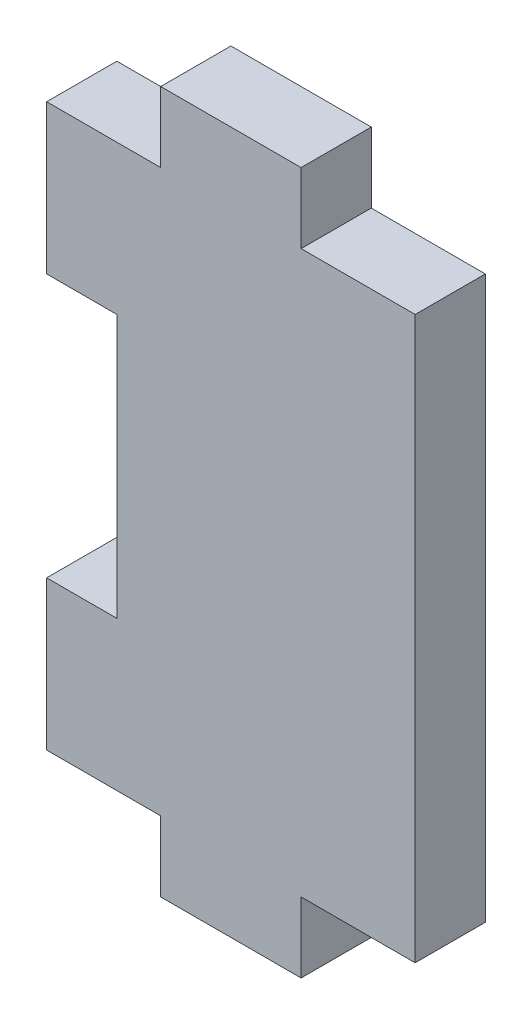
ISO-10303-21;
HEADER;
FILE_DESCRIPTION(('STEP AP214'),'2;1');
FILE_NAME('part.step','',(''),(''),'','','');
FILE_SCHEMA(('AUTOMOTIVE_DESIGN { 1 0 10303 214 1 1 1 1 }'));
ENDSEC;
DATA;
#1=APPLICATION_CONTEXT('core data for automotive mechanical design processes');
#2=APPLICATION_PROTOCOL_DEFINITION('international standard','automotive_design',2000,#1);
#3=PRODUCT_CONTEXT('',#1,'mechanical');
#4=PRODUCT('Part','Part','',(#3));
#5=PRODUCT_RELATED_PRODUCT_CATEGORY('part','',(#4));
#6=PRODUCT_DEFINITION_FORMATION('','',#4);
#7=PRODUCT_DEFINITION_CONTEXT('part definition',#1,'design');
#8=PRODUCT_DEFINITION('design','',#6,#7);
#9=PRODUCT_DEFINITION_SHAPE('','',#8);
#10=(LENGTH_UNIT() NAMED_UNIT(*) SI_UNIT(.MILLI.,.METRE.));
#11=(NAMED_UNIT(*) PLANE_ANGLE_UNIT() SI_UNIT($,.RADIAN.));
#12=(NAMED_UNIT(*) SI_UNIT($,.STERADIAN.) SOLID_ANGLE_UNIT());
#13=UNCERTAINTY_MEASURE_WITH_UNIT(LENGTH_MEASURE(1.E-05),#10,'distance_accuracy_value','');
#14=(GEOMETRIC_REPRESENTATION_CONTEXT(3) GLOBAL_UNCERTAINTY_ASSIGNED_CONTEXT((#13)) GLOBAL_UNIT_ASSIGNED_CONTEXT((#10,
#11,#12)) REPRESENTATION_CONTEXT('',''));
#15=CARTESIAN_POINT('',(0.,0.,0.));
#16=DIRECTION('',(0.,0.,1.));
#17=DIRECTION('',(1.,0.,0.));
#18=AXIS2_PLACEMENT_3D('',#15,#16,#17);
#19=CARTESIAN_POINT('',(0.,0.,4.));
#20=DIRECTION('',(1.,0.,0.));
#21=DIRECTION('',(0.,0.,-1.));
#22=AXIS2_PLACEMENT_3D('',#19,#20,#21);
#23=PLANE('',#22);
#24=DIRECTION('',(0.,-1.,0.));
#25=VECTOR('',#24,1.);
#26=CARTESIAN_POINT('',(0.,0.,0.));
#27=LINE('',#26,#25);
#28=CARTESIAN_POINT('',(0.,36.,0.));
#29=VERTEX_POINT('',#28);
#30=CARTESIAN_POINT('',(0.,27.5,0.));
#31=VERTEX_POINT('',#30);
#32=EDGE_CURVE('E193',#29,#31,#27,.T.);
#33=ORIENTED_EDGE('',*,*,#32,.T.);
#34=DIRECTION('',(0.,0.,1.));
#35=VECTOR('',#34,1.);
#36=CARTESIAN_POINT('',(0.,27.5,0.));
#37=LINE('',#36,#35);
#38=CARTESIAN_POINT('',(0.,27.5,4.));
#39=VERTEX_POINT('',#38);
#40=EDGE_CURVE('E282',#31,#39,#37,.T.);
#41=ORIENTED_EDGE('',*,*,#40,.T.);
#42=DIRECTION('',(0.,-1.,0.));
#43=VECTOR('',#42,1.);
#44=CARTESIAN_POINT('',(0.,0.,4.));
#45=LINE('',#44,#43);
#46=CARTESIAN_POINT('',(0.,36.,4.));
#47=VERTEX_POINT('',#46);
#48=EDGE_CURVE('E234',#47,#39,#45,.T.);
#49=ORIENTED_EDGE('',*,*,#48,.F.);
#50=DIRECTION('',(0.,0.,1.));
#51=VECTOR('',#50,1.);
#52=CARTESIAN_POINT('',(0.,36.,0.));
#53=LINE('',#52,#51);
#54=EDGE_CURVE('E224',#29,#47,#53,.T.);
#55=ORIENTED_EDGE('',*,*,#54,.F.);
#56=EDGE_LOOP('',(#33,#41,#49,#55));
#57=FACE_BOUND('',#56,.T.);
#58=ADVANCED_FACE('F42',(#57),#23,.F.);
#59=CARTESIAN_POINT('',(0.,12.5,4.));
#60=VERTEX_POINT('',#59);
#61=CARTESIAN_POINT('',(0.,3.99999999999999,4.));
#62=VERTEX_POINT('',#61);
#63=EDGE_CURVE('E191',#60,#62,#45,.T.);
#64=ORIENTED_EDGE('',*,*,#63,.F.);
#65=DIRECTION('',(0.,0.,1.));
#66=VECTOR('',#65,1.);
#67=CARTESIAN_POINT('',(0.,12.5,0.));
#68=LINE('',#67,#66);
#69=CARTESIAN_POINT('',(0.,12.5,0.));
#70=VERTEX_POINT('',#69);
#71=EDGE_CURVE('E298',#70,#60,#68,.T.);
#72=ORIENTED_EDGE('',*,*,#71,.F.);
#73=CARTESIAN_POINT('',(0.,3.99999999999999,0.));
#74=VERTEX_POINT('',#73);
#75=EDGE_CURVE('E196',#70,#74,#27,.T.);
#76=ORIENTED_EDGE('',*,*,#75,.T.);
#77=DIRECTION('',(0.,0.,1.));
#78=VECTOR('',#77,1.);
#79=CARTESIAN_POINT('',(0.,3.99999999999999,0.));
#80=LINE('',#79,#78);
#81=EDGE_CURVE('E268',#74,#62,#80,.T.);
#82=ORIENTED_EDGE('',*,*,#81,.T.);
#83=EDGE_LOOP('',(#64,#72,#76,#82));
#84=FACE_BOUND('',#83,.T.);
#85=ADVANCED_FACE('F44',(#84),#23,.F.);
#86=CARTESIAN_POINT('',(0.,0.,4.));
#87=DIRECTION('',(0.,1.,0.));
#88=DIRECTION('',(0.,0.,1.));
#89=AXIS2_PLACEMENT_3D('',#86,#87,#88);
#90=PLANE('',#89);
#91=DIRECTION('',(1.,0.,0.));
#92=VECTOR('',#91,1.);
#93=CARTESIAN_POINT('',(0.,0.,4.));
#94=LINE('',#93,#92);
#95=CARTESIAN_POINT('',(6.49999999999992,0.,4.));
#96=VERTEX_POINT('',#95);
#97=CARTESIAN_POINT('',(14.5000000000001,0.,4.));
#98=VERTEX_POINT('',#97);
#99=EDGE_CURVE('E235',#96,#98,#94,.T.);
#100=ORIENTED_EDGE('',*,*,#99,.F.);
#101=DIRECTION('',(0.,0.,1.));
#102=VECTOR('',#101,1.);
#103=CARTESIAN_POINT('',(6.49999999999992,0.,0.));
#104=LINE('',#103,#102);
#105=CARTESIAN_POINT('',(6.49999999999992,0.,0.));
#106=VERTEX_POINT('',#105);
#107=EDGE_CURVE('E265',#106,#96,#104,.T.);
#108=ORIENTED_EDGE('',*,*,#107,.F.);
#109=DIRECTION('',(1.,0.,0.));
#110=VECTOR('',#109,1.);
#111=CARTESIAN_POINT('',(0.,0.,0.));
#112=LINE('',#111,#110);
#113=CARTESIAN_POINT('',(14.5000000000001,0.,0.));
#114=VERTEX_POINT('',#113);
#115=EDGE_CURVE('E187',#106,#114,#112,.T.);
#116=ORIENTED_EDGE('',*,*,#115,.T.);
#117=DIRECTION('',(0.,0.,1.));
#118=VECTOR('',#117,1.);
#119=CARTESIAN_POINT('',(14.5000000000001,0.,0.));
#120=LINE('',#119,#118);
#121=EDGE_CURVE('E363',#114,#98,#120,.T.);
#122=ORIENTED_EDGE('',*,*,#121,.T.);
#123=EDGE_LOOP('',(#100,#108,#116,#122));
#124=FACE_BOUND('',#123,.T.);
#125=ADVANCED_FACE('F377',(#124),#90,.F.);
#126=CARTESIAN_POINT('',(21.,0.,4.));
#127=DIRECTION('',(-1.,0.,0.));
#128=DIRECTION('',(0.,0.,1.));
#129=AXIS2_PLACEMENT_3D('',#126,#127,#128);
#130=PLANE('',#129);
#131=DIRECTION('',(0.,1.,0.));
#132=VECTOR('',#131,1.);
#133=CARTESIAN_POINT('',(21.,0.,4.));
#134=LINE('',#133,#132);
#135=CARTESIAN_POINT('',(21.,4.,4.));
#136=VERTEX_POINT('',#135);
#137=CARTESIAN_POINT('',(21.,36.,4.));
#138=VERTEX_POINT('',#137);
#139=EDGE_CURVE('E52',#136,#138,#134,.T.);
#140=ORIENTED_EDGE('',*,*,#139,.F.);
#141=DIRECTION('',(0.,0.,1.));
#142=VECTOR('',#141,1.);
#143=CARTESIAN_POINT('',(21.,4.,0.));
#144=LINE('',#143,#142);
#145=CARTESIAN_POINT('',(21.,4.,0.));
#146=VERTEX_POINT('',#145);
#147=EDGE_CURVE('E185',#146,#136,#144,.T.);
#148=ORIENTED_EDGE('',*,*,#147,.F.);
#149=DIRECTION('',(0.,1.,0.));
#150=VECTOR('',#149,1.);
#151=CARTESIAN_POINT('',(21.,0.,0.));
#152=LINE('',#151,#150);
#153=CARTESIAN_POINT('',(21.,36.,0.));
#154=VERTEX_POINT('',#153);
#155=EDGE_CURVE('E178',#146,#154,#152,.T.);
#156=ORIENTED_EDGE('',*,*,#155,.T.);
#157=DIRECTION('',(0.,0.,1.));
#158=VECTOR('',#157,1.);
#159=CARTESIAN_POINT('',(21.,36.,0.));
#160=LINE('',#159,#158);
#161=EDGE_CURVE('E157',#154,#138,#160,.T.);
#162=ORIENTED_EDGE('',*,*,#161,.T.);
#163=EDGE_LOOP('',(#140,#148,#156,#162));
#164=FACE_BOUND('',#163,.T.);
#165=ADVANCED_FACE('F184',(#164),#130,.F.);
#166=CARTESIAN_POINT('',(0.,40.,4.));
#167=DIRECTION('',(0.,-1.,0.));
#168=DIRECTION('',(0.,0.,-1.));
#169=AXIS2_PLACEMENT_3D('',#166,#167,#168);
#170=PLANE('',#169);
#171=DIRECTION('',(-1.,0.,0.));
#172=VECTOR('',#171,1.);
#173=CARTESIAN_POINT('',(0.,40.,4.));
#174=LINE('',#173,#172);
#175=CARTESIAN_POINT('',(14.5000000000001,40.,4.));
#176=VERTEX_POINT('',#175);
#177=CARTESIAN_POINT('',(6.49999999999992,40.,4.));
#178=VERTEX_POINT('',#177);
#179=EDGE_CURVE('E12',#176,#178,#174,.T.);
#180=ORIENTED_EDGE('',*,*,#179,.F.);
#181=DIRECTION('',(0.,0.,1.));
#182=VECTOR('',#181,1.);
#183=CARTESIAN_POINT('',(14.5000000000001,40.,0.));
#184=LINE('',#183,#182);
#185=CARTESIAN_POINT('',(14.5000000000001,40.,0.));
#186=VERTEX_POINT('',#185);
#187=EDGE_CURVE('E169',#186,#176,#184,.T.);
#188=ORIENTED_EDGE('',*,*,#187,.F.);
#189=DIRECTION('',(-1.,0.,0.));
#190=VECTOR('',#189,1.);
#191=CARTESIAN_POINT('',(0.,40.,0.));
#192=LINE('',#191,#190);
#193=CARTESIAN_POINT('',(6.49999999999992,40.,0.));
#194=VERTEX_POINT('',#193);
#195=EDGE_CURVE('E46',#186,#194,#192,.T.);
#196=ORIENTED_EDGE('',*,*,#195,.T.);
#197=DIRECTION('',(0.,0.,1.));
#198=VECTOR('',#197,1.);
#199=CARTESIAN_POINT('',(6.49999999999992,40.,0.));
#200=LINE('',#199,#198);
#201=EDGE_CURVE('E227',#194,#178,#200,.T.);
#202=ORIENTED_EDGE('',*,*,#201,.T.);
#203=EDGE_LOOP('',(#180,#188,#196,#202));
#204=FACE_BOUND('',#203,.T.);
#205=ADVANCED_FACE('F383',(#204),#170,.F.);
#206=CARTESIAN_POINT('',(0.,0.,4.));
#207=DIRECTION('',(0.,0.,-1.));
#208=DIRECTION('',(-1.,0.,0.));
#209=AXIS2_PLACEMENT_3D('',#206,#207,#208);
#210=PLANE('',#209);
#211=ORIENTED_EDGE('',*,*,#48,.T.);
#212=DIRECTION('',(-1.,0.,0.));
#213=VECTOR('',#212,1.);
#214=CARTESIAN_POINT('',(4.00000000000001,27.5,4.));
#215=LINE('',#214,#213);
#216=CARTESIAN_POINT('',(4.00000000000001,27.5,4.));
#217=VERTEX_POINT('',#216);
#218=EDGE_CURVE('E283',#217,#39,#215,.T.);
#219=ORIENTED_EDGE('',*,*,#218,.F.);
#220=DIRECTION('',(0.,1.,0.));
#221=VECTOR('',#220,1.);
#222=CARTESIAN_POINT('',(4.00000000000001,27.5,4.));
#223=LINE('',#222,#221);
#224=CARTESIAN_POINT('',(4.,12.5,4.));
#225=VERTEX_POINT('',#224);
#226=EDGE_CURVE('E276',#225,#217,#223,.T.);
#227=ORIENTED_EDGE('',*,*,#226,.F.);
#228=DIRECTION('',(1.,0.,0.));
#229=VECTOR('',#228,1.);
#230=CARTESIAN_POINT('',(4.,12.5,4.));
#231=LINE('',#230,#229);
#232=EDGE_CURVE('E286',#60,#225,#231,.T.);
#233=ORIENTED_EDGE('',*,*,#232,.F.);
#234=ORIENTED_EDGE('',*,*,#63,.T.);
#235=DIRECTION('',(-1.,0.,0.));
#236=VECTOR('',#235,1.);
#237=CARTESIAN_POINT('',(6.49999999999993,4.,4.));
#238=LINE('',#237,#236);
#239=CARTESIAN_POINT('',(6.49999999999993,4.,4.));
#240=VERTEX_POINT('',#239);
#241=EDGE_CURVE('E249',#240,#62,#238,.T.);
#242=ORIENTED_EDGE('',*,*,#241,.F.);
#243=DIRECTION('',(0.,1.,0.));
#244=VECTOR('',#243,1.);
#245=CARTESIAN_POINT('',(6.49999999999993,4.,4.));
#246=LINE('',#245,#244);
#247=EDGE_CURVE('E253',#96,#240,#246,.T.);
#248=ORIENTED_EDGE('',*,*,#247,.F.);
#249=ORIENTED_EDGE('',*,*,#99,.T.);
#250=DIRECTION('',(0.,-1.,0.));
#251=VECTOR('',#250,1.);
#252=CARTESIAN_POINT('',(14.5000000000001,4.,4.));
#253=LINE('',#252,#251);
#254=CARTESIAN_POINT('',(14.5000000000001,4.,4.));
#255=VERTEX_POINT('',#254);
#256=EDGE_CURVE('E264',#255,#98,#253,.T.);
#257=ORIENTED_EDGE('',*,*,#256,.F.);
#258=DIRECTION('',(-1.,0.,0.));
#259=VECTOR('',#258,1.);
#260=CARTESIAN_POINT('',(14.5000000000001,4.,4.));
#261=LINE('',#260,#259);
#262=EDGE_CURVE('E330',#136,#255,#261,.T.);
#263=ORIENTED_EDGE('',*,*,#262,.F.);
#264=ORIENTED_EDGE('',*,*,#139,.T.);
#265=DIRECTION('',(1.,0.,0.));
#266=VECTOR('',#265,1.);
#267=CARTESIAN_POINT('',(14.5000000000001,36.,4.));
#268=LINE('',#267,#266);
#269=CARTESIAN_POINT('',(14.5000000000001,36.,4.));
#270=VERTEX_POINT('',#269);
#271=EDGE_CURVE('E163',#270,#138,#268,.T.);
#272=ORIENTED_EDGE('',*,*,#271,.F.);
#273=DIRECTION('',(0.,-1.,0.));
#274=VECTOR('',#273,1.);
#275=CARTESIAN_POINT('',(14.5000000000001,36.,4.));
#276=LINE('',#275,#274);
#277=EDGE_CURVE('E181',#176,#270,#276,.T.);
#278=ORIENTED_EDGE('',*,*,#277,.F.);
#279=ORIENTED_EDGE('',*,*,#179,.T.);
#280=DIRECTION('',(0.,1.,0.));
#281=VECTOR('',#280,1.);
#282=CARTESIAN_POINT('',(6.49999999999992,36.,4.));
#283=LINE('',#282,#281);
#284=CARTESIAN_POINT('',(6.49999999999992,36.,4.));
#285=VERTEX_POINT('',#284);
#286=EDGE_CURVE('E209',#285,#178,#283,.T.);
#287=ORIENTED_EDGE('',*,*,#286,.F.);
#288=DIRECTION('',(1.,0.,0.));
#289=VECTOR('',#288,1.);
#290=CARTESIAN_POINT('',(6.49999999999992,36.,4.));
#291=LINE('',#290,#289);
#292=EDGE_CURVE('E213',#47,#285,#291,.T.);
#293=ORIENTED_EDGE('',*,*,#292,.F.);
#294=EDGE_LOOP('',(#211,#219,#227,#233,#234,#242,#248,#249,#257,#263,#264,#272,#278,#279,#287,#293));
#295=FACE_BOUND('',#294,.T.);
#296=ADVANCED_FACE('F327',(#295),#210,.F.);
#297=CARTESIAN_POINT('',(0.,0.,0.));
#298=DIRECTION('',(0.,0.,-1.));
#299=DIRECTION('',(-1.,0.,0.));
#300=AXIS2_PLACEMENT_3D('',#297,#298,#299);
#301=PLANE('',#300);
#302=DIRECTION('',(-1.,0.,0.));
#303=VECTOR('',#302,1.);
#304=CARTESIAN_POINT('',(4.00000000000001,27.5,0.));
#305=LINE('',#304,#303);
#306=CARTESIAN_POINT('',(4.00000000000001,27.5,0.));
#307=VERTEX_POINT('',#306);
#308=EDGE_CURVE('E272',#307,#31,#305,.T.);
#309=ORIENTED_EDGE('',*,*,#308,.T.);
#310=ORIENTED_EDGE('',*,*,#32,.F.);
#311=DIRECTION('',(1.,0.,0.));
#312=VECTOR('',#311,1.);
#313=CARTESIAN_POINT('',(6.49999999999992,36.,0.));
#314=LINE('',#313,#312);
#315=CARTESIAN_POINT('',(6.49999999999992,36.,0.));
#316=VERTEX_POINT('',#315);
#317=EDGE_CURVE('E215',#29,#316,#314,.T.);
#318=ORIENTED_EDGE('',*,*,#317,.T.);
#319=DIRECTION('',(0.,1.,0.));
#320=VECTOR('',#319,1.);
#321=CARTESIAN_POINT('',(6.49999999999992,36.,0.));
#322=LINE('',#321,#320);
#323=EDGE_CURVE('E221',#316,#194,#322,.T.);
#324=ORIENTED_EDGE('',*,*,#323,.T.);
#325=ORIENTED_EDGE('',*,*,#195,.F.);
#326=DIRECTION('',(0.,-1.,0.));
#327=VECTOR('',#326,1.);
#328=CARTESIAN_POINT('',(14.5000000000001,36.,0.));
#329=LINE('',#328,#327);
#330=CARTESIAN_POINT('',(14.5000000000001,36.,0.));
#331=VERTEX_POINT('',#330);
#332=EDGE_CURVE('E170',#186,#331,#329,.T.);
#333=ORIENTED_EDGE('',*,*,#332,.T.);
#334=DIRECTION('',(1.,0.,0.));
#335=VECTOR('',#334,1.);
#336=CARTESIAN_POINT('',(14.5000000000001,36.,0.));
#337=LINE('',#336,#335);
#338=EDGE_CURVE('E160',#331,#154,#337,.T.);
#339=ORIENTED_EDGE('',*,*,#338,.T.);
#340=ORIENTED_EDGE('',*,*,#155,.F.);
#341=DIRECTION('',(-1.,0.,0.));
#342=VECTOR('',#341,1.);
#343=CARTESIAN_POINT('',(14.5000000000001,4.,0.));
#344=LINE('',#343,#342);
#345=CARTESIAN_POINT('',(14.5000000000001,4.,0.));
#346=VERTEX_POINT('',#345);
#347=EDGE_CURVE('E339',#146,#346,#344,.T.);
#348=ORIENTED_EDGE('',*,*,#347,.T.);
#349=DIRECTION('',(0.,-1.,0.));
#350=VECTOR('',#349,1.);
#351=CARTESIAN_POINT('',(14.5000000000001,4.,0.));
#352=LINE('',#351,#350);
#353=EDGE_CURVE('E334',#346,#114,#352,.T.);
#354=ORIENTED_EDGE('',*,*,#353,.T.);
#355=ORIENTED_EDGE('',*,*,#115,.F.);
#356=DIRECTION('',(0.,1.,0.));
#357=VECTOR('',#356,1.);
#358=CARTESIAN_POINT('',(6.49999999999993,4.,0.));
#359=LINE('',#358,#357);
#360=CARTESIAN_POINT('',(6.49999999999993,4.,0.));
#361=VERTEX_POINT('',#360);
#362=EDGE_CURVE('E255',#106,#361,#359,.T.);
#363=ORIENTED_EDGE('',*,*,#362,.T.);
#364=DIRECTION('',(-1.,0.,0.));
#365=VECTOR('',#364,1.);
#366=CARTESIAN_POINT('',(6.49999999999993,4.,0.));
#367=LINE('',#366,#365);
#368=EDGE_CURVE('E68',#361,#74,#367,.T.);
#369=ORIENTED_EDGE('',*,*,#368,.T.);
#370=ORIENTED_EDGE('',*,*,#75,.F.);
#371=DIRECTION('',(1.,0.,0.));
#372=VECTOR('',#371,1.);
#373=CARTESIAN_POINT('',(4.,12.5,0.));
#374=LINE('',#373,#372);
#375=CARTESIAN_POINT('',(4.,12.5,0.));
#376=VERTEX_POINT('',#375);
#377=EDGE_CURVE('E275',#70,#376,#374,.T.);
#378=ORIENTED_EDGE('',*,*,#377,.T.);
#379=DIRECTION('',(0.,1.,0.));
#380=VECTOR('',#379,1.);
#381=CARTESIAN_POINT('',(4.00000000000001,27.5,0.));
#382=LINE('',#381,#380);
#383=EDGE_CURVE('E60',#376,#307,#382,.T.);
#384=ORIENTED_EDGE('',*,*,#383,.T.);
#385=EDGE_LOOP('',(#309,#310,#318,#324,#325,#333,#339,#340,#348,#354,#355,#363,#369,#370,#378,#384));
#386=FACE_BOUND('',#385,.T.);
#387=ADVANCED_FACE('F176',(#386),#301,.T.);
#388=CARTESIAN_POINT('',(6.49999999999992,36.,0.));
#389=DIRECTION('',(1.,0.,0.));
#390=DIRECTION('',(0.,0.,-1.));
#391=AXIS2_PLACEMENT_3D('',#388,#389,#390);
#392=PLANE('',#391);
#393=ORIENTED_EDGE('',*,*,#286,.T.);
#394=ORIENTED_EDGE('',*,*,#201,.F.);
#395=ORIENTED_EDGE('',*,*,#323,.F.);
#396=DIRECTION('',(0.,0.,1.));
#397=VECTOR('',#396,1.);
#398=CARTESIAN_POINT('',(6.49999999999992,36.,0.));
#399=LINE('',#398,#397);
#400=EDGE_CURVE('E199',#316,#285,#399,.T.);
#401=ORIENTED_EDGE('',*,*,#400,.T.);
#402=EDGE_LOOP('',(#393,#394,#395,#401));
#403=FACE_BOUND('',#402,.T.);
#404=ADVANCED_FACE('F429',(#403),#392,.F.);
#405=CARTESIAN_POINT('',(6.49999999999992,36.,0.));
#406=DIRECTION('',(0.,-1.,0.));
#407=DIRECTION('',(0.,0.,-1.));
#408=AXIS2_PLACEMENT_3D('',#405,#406,#407);
#409=PLANE('',#408);
#410=ORIENTED_EDGE('',*,*,#292,.T.);
#411=ORIENTED_EDGE('',*,*,#400,.F.);
#412=ORIENTED_EDGE('',*,*,#317,.F.);
#413=ORIENTED_EDGE('',*,*,#54,.T.);
#414=EDGE_LOOP('',(#410,#411,#412,#413));
#415=FACE_BOUND('',#414,.T.);
#416=ADVANCED_FACE('F312',(#415),#409,.F.);
#417=CARTESIAN_POINT('',(14.5000000000001,36.,0.));
#418=DIRECTION('',(0.,-1.,0.));
#419=DIRECTION('',(0.,0.,-1.));
#420=AXIS2_PLACEMENT_3D('',#417,#418,#419);
#421=PLANE('',#420);
#422=ORIENTED_EDGE('',*,*,#271,.T.);
#423=ORIENTED_EDGE('',*,*,#161,.F.);
#424=ORIENTED_EDGE('',*,*,#338,.F.);
#425=DIRECTION('',(0.,0.,1.));
#426=VECTOR('',#425,1.);
#427=CARTESIAN_POINT('',(14.5000000000001,36.,0.));
#428=LINE('',#427,#426);
#429=EDGE_CURVE('E214',#331,#270,#428,.T.);
#430=ORIENTED_EDGE('',*,*,#429,.T.);
#431=EDGE_LOOP('',(#422,#423,#424,#430));
#432=FACE_BOUND('',#431,.T.);
#433=ADVANCED_FACE('F159',(#432),#421,.F.);
#434=CARTESIAN_POINT('',(14.5000000000001,36.,0.));
#435=DIRECTION('',(-1.,0.,0.));
#436=DIRECTION('',(0.,0.,1.));
#437=AXIS2_PLACEMENT_3D('',#434,#435,#436);
#438=PLANE('',#437);
#439=ORIENTED_EDGE('',*,*,#277,.T.);
#440=ORIENTED_EDGE('',*,*,#429,.F.);
#441=ORIENTED_EDGE('',*,*,#332,.F.);
#442=ORIENTED_EDGE('',*,*,#187,.T.);
#443=EDGE_LOOP('',(#439,#440,#441,#442));
#444=FACE_BOUND('',#443,.T.);
#445=ADVANCED_FACE('F455',(#444),#438,.F.);
#446=CARTESIAN_POINT('',(14.5000000000001,4.,0.));
#447=DIRECTION('',(-1.,0.,0.));
#448=DIRECTION('',(0.,0.,1.));
#449=AXIS2_PLACEMENT_3D('',#446,#447,#448);
#450=PLANE('',#449);
#451=ORIENTED_EDGE('',*,*,#256,.T.);
#452=ORIENTED_EDGE('',*,*,#121,.F.);
#453=ORIENTED_EDGE('',*,*,#353,.F.);
#454=DIRECTION('',(0.,0.,1.));
#455=VECTOR('',#454,1.);
#456=CARTESIAN_POINT('',(14.5000000000001,4.,0.));
#457=LINE('',#456,#455);
#458=EDGE_CURVE('E346',#346,#255,#457,.T.);
#459=ORIENTED_EDGE('',*,*,#458,.T.);
#460=EDGE_LOOP('',(#451,#452,#453,#459));
#461=FACE_BOUND('',#460,.T.);
#462=ADVANCED_FACE('F464',(#461),#450,.F.);
#463=CARTESIAN_POINT('',(14.5000000000001,4.,0.));
#464=DIRECTION('',(0.,1.,0.));
#465=DIRECTION('',(0.,0.,1.));
#466=AXIS2_PLACEMENT_3D('',#463,#464,#465);
#467=PLANE('',#466);
#468=ORIENTED_EDGE('',*,*,#262,.T.);
#469=ORIENTED_EDGE('',*,*,#458,.F.);
#470=ORIENTED_EDGE('',*,*,#347,.F.);
#471=ORIENTED_EDGE('',*,*,#147,.T.);
#472=EDGE_LOOP('',(#468,#469,#470,#471));
#473=FACE_BOUND('',#472,.T.);
#474=ADVANCED_FACE('F474',(#473),#467,.F.);
#475=CARTESIAN_POINT('',(6.49999999999993,4.,0.));
#476=DIRECTION('',(0.,1.,0.));
#477=DIRECTION('',(-1.,0.,0.));
#478=AXIS2_PLACEMENT_3D('',#475,#476,#477);
#479=PLANE('',#478);
#480=ORIENTED_EDGE('',*,*,#241,.T.);
#481=ORIENTED_EDGE('',*,*,#81,.F.);
#482=ORIENTED_EDGE('',*,*,#368,.F.);
#483=DIRECTION('',(0.,0.,1.));
#484=VECTOR('',#483,1.);
#485=CARTESIAN_POINT('',(6.49999999999993,4.,0.));
#486=LINE('',#485,#484);
#487=EDGE_CURVE('E261',#361,#240,#486,.T.);
#488=ORIENTED_EDGE('',*,*,#487,.T.);
#489=EDGE_LOOP('',(#480,#481,#482,#488));
#490=FACE_BOUND('',#489,.T.);
#491=ADVANCED_FACE('F484',(#490),#479,.F.);
#492=CARTESIAN_POINT('',(6.49999999999993,4.,0.));
#493=DIRECTION('',(1.,0.,0.));
#494=DIRECTION('',(0.,1.,0.));
#495=AXIS2_PLACEMENT_3D('',#492,#493,#494);
#496=PLANE('',#495);
#497=ORIENTED_EDGE('',*,*,#247,.T.);
#498=ORIENTED_EDGE('',*,*,#487,.F.);
#499=ORIENTED_EDGE('',*,*,#362,.F.);
#500=ORIENTED_EDGE('',*,*,#107,.T.);
#501=EDGE_LOOP('',(#497,#498,#499,#500));
#502=FACE_BOUND('',#501,.T.);
#503=ADVANCED_FACE('F376',(#502),#496,.F.);
#504=CARTESIAN_POINT('',(4.00000000000001,27.5,0.));
#505=DIRECTION('',(0.,1.,0.));
#506=DIRECTION('',(0.,0.,1.));
#507=AXIS2_PLACEMENT_3D('',#504,#505,#506);
#508=PLANE('',#507);
#509=ORIENTED_EDGE('',*,*,#218,.T.);
#510=ORIENTED_EDGE('',*,*,#40,.F.);
#511=ORIENTED_EDGE('',*,*,#308,.F.);
#512=DIRECTION('',(0.,0.,1.));
#513=VECTOR('',#512,1.);
#514=CARTESIAN_POINT('',(4.00000000000001,27.5,0.));
#515=LINE('',#514,#513);
#516=EDGE_CURVE('E254',#307,#217,#515,.T.);
#517=ORIENTED_EDGE('',*,*,#516,.T.);
#518=EDGE_LOOP('',(#509,#510,#511,#517));
#519=FACE_BOUND('',#518,.T.);
#520=ADVANCED_FACE('F501',(#519),#508,.F.);
#521=CARTESIAN_POINT('',(4.00000000000001,27.5,0.));
#522=DIRECTION('',(1.,0.,0.));
#523=DIRECTION('',(0.,1.,0.));
#524=AXIS2_PLACEMENT_3D('',#521,#522,#523);
#525=PLANE('',#524);
#526=ORIENTED_EDGE('',*,*,#226,.T.);
#527=ORIENTED_EDGE('',*,*,#516,.F.);
#528=ORIENTED_EDGE('',*,*,#383,.F.);
#529=DIRECTION('',(0.,0.,1.));
#530=VECTOR('',#529,1.);
#531=CARTESIAN_POINT('',(4.,12.5,0.));
#532=LINE('',#531,#530);
#533=EDGE_CURVE('E295',#376,#225,#532,.T.);
#534=ORIENTED_EDGE('',*,*,#533,.T.);
#535=EDGE_LOOP('',(#526,#527,#528,#534));
#536=FACE_BOUND('',#535,.T.);
#537=ADVANCED_FACE('F510',(#536),#525,.F.);
#538=CARTESIAN_POINT('',(4.,12.5,0.));
#539=DIRECTION('',(0.,-1.,0.));
#540=DIRECTION('',(0.,0.,-1.));
#541=AXIS2_PLACEMENT_3D('',#538,#539,#540);
#542=PLANE('',#541);
#543=ORIENTED_EDGE('',*,*,#232,.T.);
#544=ORIENTED_EDGE('',*,*,#533,.F.);
#545=ORIENTED_EDGE('',*,*,#377,.F.);
#546=ORIENTED_EDGE('',*,*,#71,.T.);
#547=EDGE_LOOP('',(#543,#544,#545,#546));
#548=FACE_BOUND('',#547,.T.);
#549=ADVANCED_FACE('F520',(#548),#542,.F.);
#550=CLOSED_SHELL('',(#58,#85,#125,#165,#205,#296,#387,#404,#416,#433,#445,#462,#474,#491,#503,
#520,#537,#549));
#551=MANIFOLD_SOLID_BREP('B2',#550);
#552=ADVANCED_BREP_SHAPE_REPRESENTATION('',(#18,#551),#14);
#553=SHAPE_DEFINITION_REPRESENTATION(#9,#552);
ENDSEC;
END-ISO-10303-21;
